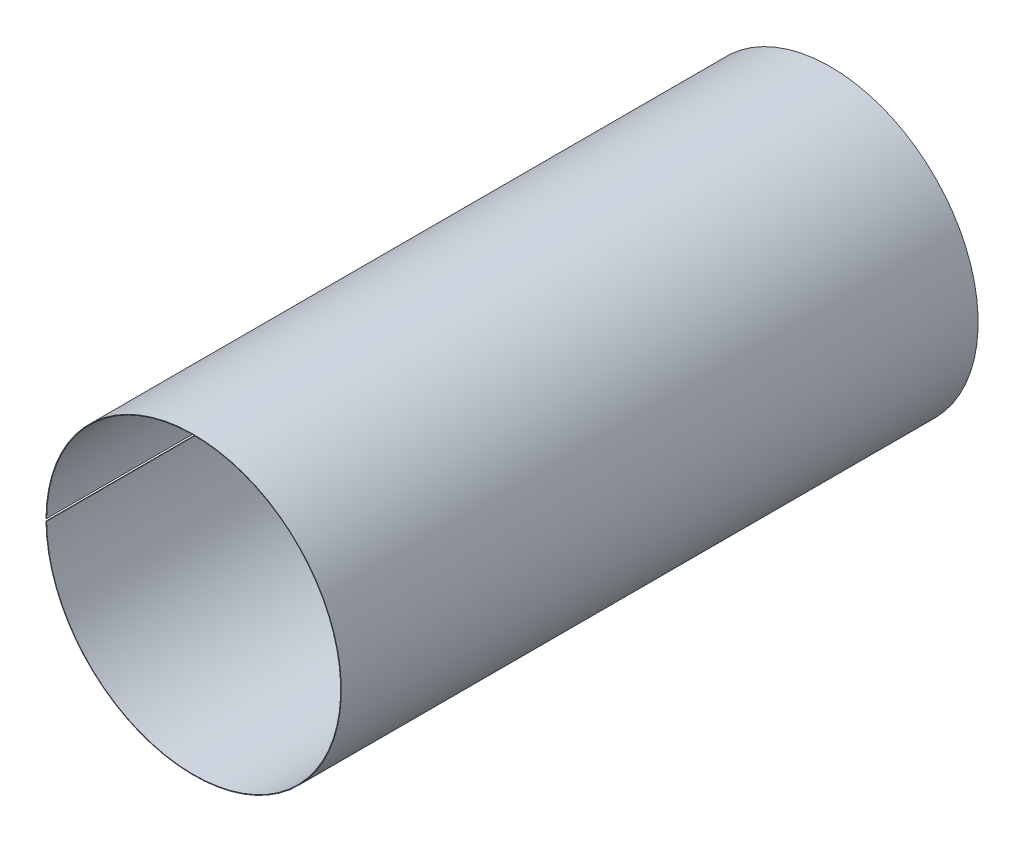
ISO-10303-21;
HEADER;
FILE_DESCRIPTION(('STEP AP214'),'2;1');
FILE_NAME('part.step','',(''),(''),'','','');
FILE_SCHEMA(('AUTOMOTIVE_DESIGN { 1 0 10303 214 1 1 1 1 }'));
ENDSEC;
DATA;
#1=APPLICATION_CONTEXT('core data for automotive mechanical design processes');
#2=APPLICATION_PROTOCOL_DEFINITION('international standard','automotive_design',2000,#1);
#3=PRODUCT_CONTEXT('',#1,'mechanical');
#4=PRODUCT('Part','Part','',(#3));
#5=PRODUCT_RELATED_PRODUCT_CATEGORY('part','',(#4));
#6=PRODUCT_DEFINITION_FORMATION('','',#4);
#7=PRODUCT_DEFINITION_CONTEXT('part definition',#1,'design');
#8=PRODUCT_DEFINITION('design','',#6,#7);
#9=PRODUCT_DEFINITION_SHAPE('','',#8);
#10=(LENGTH_UNIT() NAMED_UNIT(*) SI_UNIT(.MILLI.,.METRE.));
#11=(NAMED_UNIT(*) PLANE_ANGLE_UNIT() SI_UNIT($,.RADIAN.));
#12=(NAMED_UNIT(*) SI_UNIT($,.STERADIAN.) SOLID_ANGLE_UNIT());
#13=UNCERTAINTY_MEASURE_WITH_UNIT(LENGTH_MEASURE(1.E-05),#10,'distance_accuracy_value','');
#14=(GEOMETRIC_REPRESENTATION_CONTEXT(3) GLOBAL_UNCERTAINTY_ASSIGNED_CONTEXT((#13)) GLOBAL_UNIT_ASSIGNED_CONTEXT((#10,
#11,#12)) REPRESENTATION_CONTEXT('',''));
#15=CARTESIAN_POINT('',(0.,0.,0.));
#16=DIRECTION('',(0.,0.,1.));
#17=DIRECTION('',(1.,0.,0.));
#18=AXIS2_PLACEMENT_3D('',#15,#16,#17);
#19=CARTESIAN_POINT('',(0.,0.,279.4));
#20=DIRECTION('',(0.,0.,1.));
#21=DIRECTION('',(1.,0.,0.));
#22=AXIS2_PLACEMENT_3D('',#19,#20,#21);
#23=PLANE('',#22);
#24=DIRECTION('',(-1.,0.,0.));
#25=VECTOR('',#24,1.);
#26=CARTESIAN_POINT('',(64.771,0.507999999999995,279.4));
#27=LINE('',#26,#25);
#28=CARTESIAN_POINT('',(-64.513999968999,0.507999999999995,279.4));
#29=VERTEX_POINT('',#28);
#30=CARTESIAN_POINT('',(-64.7680078124995,0.507999999999995,279.4));
#31=VERTEX_POINT('',#30);
#32=EDGE_CURVE('E77',#29,#31,#27,.T.);
#33=ORIENTED_EDGE('',*,*,#32,.F.);
#34=CARTESIAN_POINT('',(0.,0.,279.4));
#35=DIRECTION('',(0.,0.,1.));
#36=DIRECTION('',(1.,0.,0.));
#37=AXIS2_PLACEMENT_3D('',#34,#35,#36);
#38=CIRCLE('',#37,64.516);
#39=CARTESIAN_POINT('',(-64.513999968999,-0.507999999999995,279.4));
#40=VERTEX_POINT('',#39);
#41=EDGE_CURVE('E93',#40,#29,#38,.T.);
#42=ORIENTED_EDGE('',*,*,#41,.F.);
#43=DIRECTION('',(-1.,0.,0.));
#44=VECTOR('',#43,1.);
#45=CARTESIAN_POINT('',(64.771,-0.507999999999995,279.4));
#46=LINE('',#45,#44);
#47=CARTESIAN_POINT('',(-64.7680078124995,-0.507999999999994,279.4));
#48=VERTEX_POINT('',#47);
#49=EDGE_CURVE('E58',#40,#48,#46,.T.);
#50=ORIENTED_EDGE('',*,*,#49,.T.);
#51=CARTESIAN_POINT('',(0.,0.,279.4));
#52=DIRECTION('',(0.,0.,1.));
#53=DIRECTION('',(1.,0.,0.));
#54=AXIS2_PLACEMENT_3D('',#51,#52,#53);
#55=CIRCLE('',#54,64.77);
#56=EDGE_CURVE('E11',#48,#31,#55,.T.);
#57=ORIENTED_EDGE('',*,*,#56,.T.);
#58=EDGE_LOOP('',(#33,#42,#50,#57));
#59=FACE_BOUND('',#58,.T.);
#60=ADVANCED_FACE('F35',(#59),#23,.T.);
#61=CARTESIAN_POINT('',(0.,0.,0.));
#62=DIRECTION('',(0.,0.,1.));
#63=DIRECTION('',(1.,0.,0.));
#64=AXIS2_PLACEMENT_3D('',#61,#62,#63);
#65=PLANE('',#64);
#66=CARTESIAN_POINT('',(0.,0.,0.));
#67=DIRECTION('',(0.,0.,1.));
#68=DIRECTION('',(1.,0.,0.));
#69=AXIS2_PLACEMENT_3D('',#66,#67,#68);
#70=CIRCLE('',#69,64.516);
#71=CARTESIAN_POINT('',(-64.513999968999,-0.507999999999995,0.));
#72=VERTEX_POINT('',#71);
#73=CARTESIAN_POINT('',(-64.513999968999,0.507999999999995,0.));
#74=VERTEX_POINT('',#73);
#75=EDGE_CURVE('E81',#72,#74,#70,.T.);
#76=ORIENTED_EDGE('',*,*,#75,.T.);
#77=DIRECTION('',(-1.,0.,0.));
#78=VECTOR('',#77,1.);
#79=CARTESIAN_POINT('',(64.771,0.508000000000002,0.));
#80=LINE('',#79,#78);
#81=CARTESIAN_POINT('',(-64.7680078124995,0.508000000000002,0.));
#82=VERTEX_POINT('',#81);
#83=EDGE_CURVE('E50',#74,#82,#80,.T.);
#84=ORIENTED_EDGE('',*,*,#83,.T.);
#85=CARTESIAN_POINT('',(0.,0.,0.));
#86=DIRECTION('',(0.,0.,1.));
#87=DIRECTION('',(1.,0.,0.));
#88=AXIS2_PLACEMENT_3D('',#85,#86,#87);
#89=CIRCLE('',#88,64.77);
#90=CARTESIAN_POINT('',(-64.7680078124995,-0.508000000000002,0.));
#91=VERTEX_POINT('',#90);
#92=EDGE_CURVE('E39',#91,#82,#89,.T.);
#93=ORIENTED_EDGE('',*,*,#92,.F.);
#94=DIRECTION('',(-1.,0.,0.));
#95=VECTOR('',#94,1.);
#96=CARTESIAN_POINT('',(64.771,-0.508000000000002,0.));
#97=LINE('',#96,#95);
#98=EDGE_CURVE('E100',#72,#91,#97,.T.);
#99=ORIENTED_EDGE('',*,*,#98,.F.);
#100=EDGE_LOOP('',(#76,#84,#93,#99));
#101=FACE_BOUND('',#100,.T.);
#102=ADVANCED_FACE('F87',(#101),#65,.F.);
#103=CARTESIAN_POINT('',(0.,0.,279.4));
#104=DIRECTION('',(0.,0.,-1.));
#105=DIRECTION('',(-1.,0.,0.));
#106=AXIS2_PLACEMENT_3D('',#103,#104,#105);
#107=CYLINDRICAL_SURFACE('',#106,64.77);
#108=ORIENTED_EDGE('',*,*,#92,.T.);
#109=DIRECTION('',(0.,0.,-1.));
#110=VECTOR('',#109,1.);
#111=CARTESIAN_POINT('',(-64.7680078124995,0.507999999999995,279.4));
#112=LINE('',#111,#110);
#113=EDGE_CURVE('E74',#31,#82,#112,.T.);
#114=ORIENTED_EDGE('',*,*,#113,.F.);
#115=ORIENTED_EDGE('',*,*,#56,.F.);
#116=DIRECTION('',(0.,0.,-1.));
#117=VECTOR('',#116,1.);
#118=CARTESIAN_POINT('',(-64.7680078124995,-0.507999999999995,279.4));
#119=LINE('',#118,#117);
#120=EDGE_CURVE('E82',#91,#48,#119,.F.);
#121=ORIENTED_EDGE('',*,*,#120,.F.);
#122=EDGE_LOOP('',(#108,#114,#115,#121));
#123=FACE_BOUND('',#122,.T.);
#124=ADVANCED_FACE('F37',(#123),#107,.T.);
#125=CARTESIAN_POINT('',(0.,0.,279.4));
#126=DIRECTION('',(0.,0.,-1.));
#127=DIRECTION('',(-1.,0.,0.));
#128=AXIS2_PLACEMENT_3D('',#125,#126,#127);
#129=CYLINDRICAL_SURFACE('',#128,64.516);
#130=DIRECTION('',(0.,0.,-1.));
#131=VECTOR('',#130,1.);
#132=CARTESIAN_POINT('',(-64.513999968999,0.507999999999995,279.4));
#133=LINE('',#132,#131);
#134=EDGE_CURVE('E90',#29,#74,#133,.T.);
#135=ORIENTED_EDGE('',*,*,#134,.T.);
#136=ORIENTED_EDGE('',*,*,#75,.F.);
#137=DIRECTION('',(0.,0.,-1.));
#138=VECTOR('',#137,1.);
#139=CARTESIAN_POINT('',(-64.513999968999,-0.507999999999995,279.4));
#140=LINE('',#139,#138);
#141=EDGE_CURVE('E103',#72,#40,#140,.F.);
#142=ORIENTED_EDGE('',*,*,#141,.T.);
#143=ORIENTED_EDGE('',*,*,#41,.T.);
#144=EDGE_LOOP('',(#135,#136,#142,#143));
#145=FACE_BOUND('',#144,.T.);
#146=ADVANCED_FACE('F107',(#145),#129,.F.);
#147=CARTESIAN_POINT('',(64.771,-0.508000000000002,0.));
#148=DIRECTION('',(0.,-1.,0.));
#149=DIRECTION('',(0.,0.,-1.));
#150=AXIS2_PLACEMENT_3D('',#147,#148,#149);
#151=PLANE('',#150);
#152=ORIENTED_EDGE('',*,*,#120,.T.);
#153=ORIENTED_EDGE('',*,*,#49,.F.);
#154=ORIENTED_EDGE('',*,*,#141,.F.);
#155=ORIENTED_EDGE('',*,*,#98,.T.);
#156=EDGE_LOOP('',(#152,#153,#154,#155));
#157=FACE_BOUND('',#156,.T.);
#158=ADVANCED_FACE('F117',(#157),#151,.F.);
#159=CARTESIAN_POINT('',(64.771,0.508000000000002,0.));
#160=DIRECTION('',(0.,1.,0.));
#161=DIRECTION('',(0.,0.,1.));
#162=AXIS2_PLACEMENT_3D('',#159,#160,#161);
#163=PLANE('',#162);
#164=ORIENTED_EDGE('',*,*,#113,.T.);
#165=ORIENTED_EDGE('',*,*,#83,.F.);
#166=ORIENTED_EDGE('',*,*,#134,.F.);
#167=ORIENTED_EDGE('',*,*,#32,.T.);
#168=EDGE_LOOP('',(#164,#165,#166,#167));
#169=FACE_BOUND('',#168,.T.);
#170=ADVANCED_FACE('F75',(#169),#163,.F.);
#171=CLOSED_SHELL('',(#60,#102,#124,#146,#158,#170));
#172=MANIFOLD_SOLID_BREP('B2',#171);
#173=ADVANCED_BREP_SHAPE_REPRESENTATION('',(#18,#172),#14);
#174=SHAPE_DEFINITION_REPRESENTATION(#9,#173);
ENDSEC;
END-ISO-10303-21;
